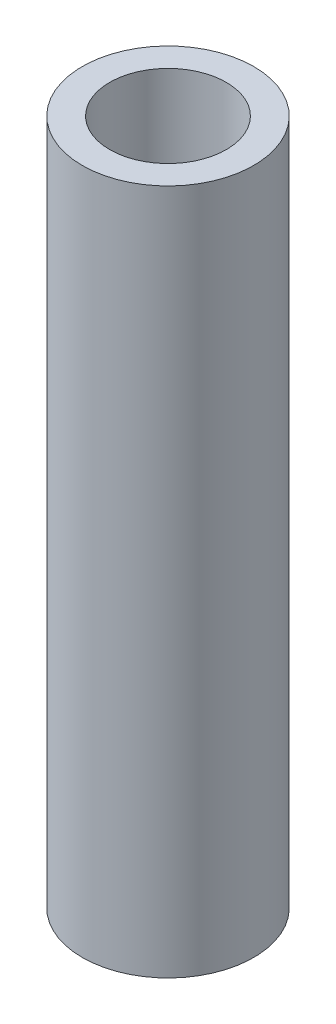
ISO-10303-21;
HEADER;
FILE_DESCRIPTION(('STEP AP214'),'2;1');
FILE_NAME('part.step','',(''),(''),'','','');
FILE_SCHEMA(('AUTOMOTIVE_DESIGN { 1 0 10303 214 1 1 1 1 }'));
ENDSEC;
DATA;
#1=APPLICATION_CONTEXT('core data for automotive mechanical design processes');
#2=APPLICATION_PROTOCOL_DEFINITION('international standard','automotive_design',2000,#1);
#3=PRODUCT_CONTEXT('',#1,'mechanical');
#4=PRODUCT('Part','Part','',(#3));
#5=PRODUCT_RELATED_PRODUCT_CATEGORY('part','',(#4));
#6=PRODUCT_DEFINITION_FORMATION('','',#4);
#7=PRODUCT_DEFINITION_CONTEXT('part definition',#1,'design');
#8=PRODUCT_DEFINITION('design','',#6,#7);
#9=PRODUCT_DEFINITION_SHAPE('','',#8);
#10=(LENGTH_UNIT() NAMED_UNIT(*) SI_UNIT(.MILLI.,.METRE.));
#11=(NAMED_UNIT(*) PLANE_ANGLE_UNIT() SI_UNIT($,.RADIAN.));
#12=(NAMED_UNIT(*) SI_UNIT($,.STERADIAN.) SOLID_ANGLE_UNIT());
#13=UNCERTAINTY_MEASURE_WITH_UNIT(LENGTH_MEASURE(1.E-05),#10,'distance_accuracy_value','');
#14=(GEOMETRIC_REPRESENTATION_CONTEXT(3) GLOBAL_UNCERTAINTY_ASSIGNED_CONTEXT((#13)) GLOBAL_UNIT_ASSIGNED_CONTEXT((#10,
#11,#12)) REPRESENTATION_CONTEXT('',''));
#15=CARTESIAN_POINT('',(0.,0.,0.));
#16=DIRECTION('',(0.,0.,1.));
#17=DIRECTION('',(1.,0.,0.));
#18=AXIS2_PLACEMENT_3D('',#15,#16,#17);
#19=CARTESIAN_POINT('',(0.,20.,0.));
#20=DIRECTION('',(0.,-1.,0.));
#21=DIRECTION('',(0.,0.,-1.));
#22=AXIS2_PLACEMENT_3D('',#19,#20,#21);
#23=CYLINDRICAL_SURFACE('',#22,2.5);
#24=CARTESIAN_POINT('',(0.,20.,0.));
#25=DIRECTION('',(0.,1.,0.));
#26=DIRECTION('',(0.,0.,1.));
#27=AXIS2_PLACEMENT_3D('',#24,#25,#26);
#28=CIRCLE('',#27,2.5);
#29=CARTESIAN_POINT('',(0.,20.,2.5));
#30=VERTEX_POINT('',#29);
#31=EDGE_CURVE('E10',#30,#30,#28,.T.);
#32=ORIENTED_EDGE('',*,*,#31,.F.);
#33=EDGE_LOOP('',(#32));
#34=FACE_BOUND('',#33,.T.);
#35=CARTESIAN_POINT('',(0.,0.,0.));
#36=DIRECTION('',(0.,1.,0.));
#37=DIRECTION('',(0.,0.,1.));
#38=AXIS2_PLACEMENT_3D('',#35,#36,#37);
#39=CIRCLE('',#38,2.5);
#40=CARTESIAN_POINT('',(0.,0.,2.5));
#41=VERTEX_POINT('',#40);
#42=EDGE_CURVE('E36',#41,#41,#39,.T.);
#43=ORIENTED_EDGE('',*,*,#42,.T.);
#44=EDGE_LOOP('',(#43));
#45=FACE_BOUND('',#44,.T.);
#46=ADVANCED_FACE('F33',(#34,#45),#23,.T.);
#47=CARTESIAN_POINT('',(0.,20.,0.));
#48=DIRECTION('',(0.,1.,0.));
#49=DIRECTION('',(0.,0.,1.));
#50=AXIS2_PLACEMENT_3D('',#47,#48,#49);
#51=PLANE('',#50);
#52=CARTESIAN_POINT('',(0.,20.,0.));
#53=DIRECTION('',(0.,1.,0.));
#54=DIRECTION('',(0.,0.,1.));
#55=AXIS2_PLACEMENT_3D('',#52,#53,#54);
#56=CIRCLE('',#55,1.69999999999999);
#57=CARTESIAN_POINT('',(0.,20.,1.69999999999999));
#58=VERTEX_POINT('',#57);
#59=EDGE_CURVE('E47',#58,#58,#56,.T.);
#60=ORIENTED_EDGE('',*,*,#59,.F.);
#61=EDGE_LOOP('',(#60));
#62=FACE_BOUND('',#61,.T.);
#63=ORIENTED_EDGE('',*,*,#31,.T.);
#64=EDGE_LOOP('',(#63));
#65=FACE_BOUND('',#64,.T.);
#66=ADVANCED_FACE('F53',(#62,#65),#51,.T.);
#67=CARTESIAN_POINT('',(0.,0.,0.));
#68=DIRECTION('',(0.,1.,0.));
#69=DIRECTION('',(0.,0.,1.));
#70=AXIS2_PLACEMENT_3D('',#67,#68,#69);
#71=PLANE('',#70);
#72=CARTESIAN_POINT('',(0.,0.,0.));
#73=DIRECTION('',(0.,1.,0.));
#74=DIRECTION('',(0.,0.,1.));
#75=AXIS2_PLACEMENT_3D('',#72,#73,#74);
#76=CIRCLE('',#75,1.69999999999999);
#77=CARTESIAN_POINT('',(0.,0.,1.69999999999999));
#78=VERTEX_POINT('',#77);
#79=EDGE_CURVE('E43',#78,#78,#76,.T.);
#80=ORIENTED_EDGE('',*,*,#79,.T.);
#81=EDGE_LOOP('',(#80));
#82=FACE_BOUND('',#81,.T.);
#83=ORIENTED_EDGE('',*,*,#42,.F.);
#84=EDGE_LOOP('',(#83));
#85=FACE_BOUND('',#84,.T.);
#86=ADVANCED_FACE('F55',(#82,#85),#71,.F.);
#87=CARTESIAN_POINT('',(0.,20.,0.));
#88=DIRECTION('',(0.,1.,0.));
#89=DIRECTION('',(0.,0.,1.));
#90=AXIS2_PLACEMENT_3D('',#87,#88,#89);
#91=CYLINDRICAL_SURFACE('',#90,1.69999999999999);
#92=ORIENTED_EDGE('',*,*,#79,.F.);
#93=EDGE_LOOP('',(#92));
#94=FACE_BOUND('',#93,.T.);
#95=ORIENTED_EDGE('',*,*,#59,.T.);
#96=EDGE_LOOP('',(#95));
#97=FACE_BOUND('',#96,.T.);
#98=ADVANCED_FACE('F51',(#94,#97),#91,.F.);
#99=CLOSED_SHELL('',(#46,#66,#86,#98));
#100=MANIFOLD_SOLID_BREP('B2',#99);
#101=ADVANCED_BREP_SHAPE_REPRESENTATION('',(#18,#100),#14);
#102=SHAPE_DEFINITION_REPRESENTATION(#9,#101);
ENDSEC;
END-ISO-10303-21;
